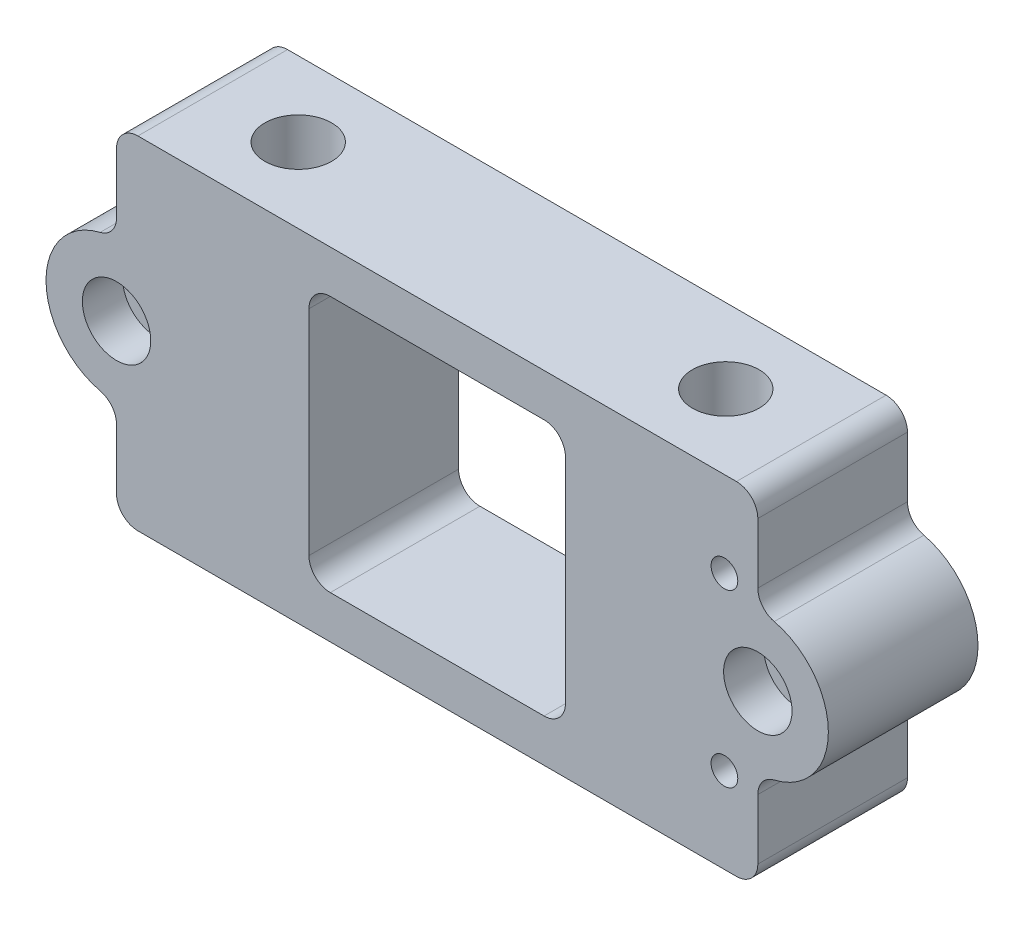
ISO-10303-21;
HEADER;
FILE_DESCRIPTION(('STEP AP214'),'2;1');
FILE_NAME('part.step','',(''),(''),'','','');
FILE_SCHEMA(('AUTOMOTIVE_DESIGN { 1 0 10303 214 1 1 1 1 }'));
ENDSEC;
DATA;
#1=APPLICATION_CONTEXT('core data for automotive mechanical design processes');
#2=APPLICATION_PROTOCOL_DEFINITION('international standard','automotive_design',2000,#1);
#3=PRODUCT_CONTEXT('',#1,'mechanical');
#4=PRODUCT('Part','Part','',(#3));
#5=PRODUCT_RELATED_PRODUCT_CATEGORY('part','',(#4));
#6=PRODUCT_DEFINITION_FORMATION('','',#4);
#7=PRODUCT_DEFINITION_CONTEXT('part definition',#1,'design');
#8=PRODUCT_DEFINITION('design','',#6,#7);
#9=PRODUCT_DEFINITION_SHAPE('','',#8);
#10=(LENGTH_UNIT() NAMED_UNIT(*) SI_UNIT(.MILLI.,.METRE.));
#11=(NAMED_UNIT(*) PLANE_ANGLE_UNIT() SI_UNIT($,.RADIAN.));
#12=(NAMED_UNIT(*) SI_UNIT($,.STERADIAN.) SOLID_ANGLE_UNIT());
#13=UNCERTAINTY_MEASURE_WITH_UNIT(LENGTH_MEASURE(1.E-05),#10,'distance_accuracy_value','');
#14=(GEOMETRIC_REPRESENTATION_CONTEXT(3) GLOBAL_UNCERTAINTY_ASSIGNED_CONTEXT((#13)) GLOBAL_UNIT_ASSIGNED_CONTEXT((#10,
#11,#12)) REPRESENTATION_CONTEXT('',''));
#15=CARTESIAN_POINT('',(0.,0.,0.));
#16=DIRECTION('',(0.,0.,1.));
#17=DIRECTION('',(1.,0.,0.));
#18=AXIS2_PLACEMENT_3D('',#15,#16,#17);
#19=CARTESIAN_POINT('',(-84.93125,0.,-17.78));
#20=DIRECTION('',(0.,0.,1.));
#21=DIRECTION('',(1.,0.,0.));
#22=AXIS2_PLACEMENT_3D('',#19,#20,#21);
#23=CYLINDRICAL_SURFACE('',#22,2.4892);
#24=CARTESIAN_POINT('',(-84.93125,0.,-17.78));
#25=DIRECTION('',(0.,0.,1.));
#26=DIRECTION('',(1.,0.,0.));
#27=AXIS2_PLACEMENT_3D('',#24,#25,#26);
#28=CIRCLE('',#27,2.4892);
#29=CARTESIAN_POINT('',(-82.44205,0.,-17.78));
#30=VERTEX_POINT('',#29);
#31=EDGE_CURVE('E446',#30,#30,#28,.T.);
#32=ORIENTED_EDGE('',*,*,#31,.F.);
#33=EDGE_LOOP('',(#32));
#34=FACE_BOUND('',#33,.T.);
#35=CARTESIAN_POINT('',(-84.93125,0.,-4.7752));
#36=DIRECTION('',(0.,0.,1.));
#37=DIRECTION('',(1.,0.,0.));
#38=AXIS2_PLACEMENT_3D('',#35,#36,#37);
#39=CIRCLE('',#38,2.4892);
#40=CARTESIAN_POINT('',(-82.44205,0.,-4.7752));
#41=VERTEX_POINT('',#40);
#42=EDGE_CURVE('E47',#41,#41,#39,.F.);
#43=ORIENTED_EDGE('',*,*,#42,.F.);
#44=EDGE_LOOP('',(#43));
#45=FACE_BOUND('',#44,.T.);
#46=ADVANCED_FACE('F43',(#34,#45),#23,.F.);
#47=CARTESIAN_POINT('',(-8.73125,0.,-17.78));
#48=DIRECTION('',(0.,0.,1.));
#49=DIRECTION('',(1.,0.,0.));
#50=AXIS2_PLACEMENT_3D('',#47,#48,#49);
#51=CYLINDRICAL_SURFACE('',#50,2.4892);
#52=CARTESIAN_POINT('',(-8.73125,0.,-17.78));
#53=DIRECTION('',(0.,0.,1.));
#54=DIRECTION('',(1.,0.,0.));
#55=AXIS2_PLACEMENT_3D('',#52,#53,#54);
#56=CIRCLE('',#55,2.4892);
#57=CARTESIAN_POINT('',(-6.24204999999999,0.,-17.78));
#58=VERTEX_POINT('',#57);
#59=EDGE_CURVE('E439',#58,#58,#56,.T.);
#60=ORIENTED_EDGE('',*,*,#59,.F.);
#61=EDGE_LOOP('',(#60));
#62=FACE_BOUND('',#61,.T.);
#63=CARTESIAN_POINT('',(-8.73125,0.,-4.7752));
#64=DIRECTION('',(0.,0.,1.));
#65=DIRECTION('',(1.,0.,0.));
#66=AXIS2_PLACEMENT_3D('',#63,#64,#65);
#67=CIRCLE('',#66,2.4892);
#68=CARTESIAN_POINT('',(-6.24204999999999,0.,-4.7752));
#69=VERTEX_POINT('',#68);
#70=EDGE_CURVE('E304',#69,#69,#67,.F.);
#71=ORIENTED_EDGE('',*,*,#70,.F.);
#72=EDGE_LOOP('',(#71));
#73=FACE_BOUND('',#72,.T.);
#74=ADVANCED_FACE('F531',(#62,#73),#51,.F.);
#75=CARTESIAN_POINT('',(-93.6625,20.32,-17.78));
#76=DIRECTION('',(0.,1.,0.));
#77=DIRECTION('',(0.,0.,1.));
#78=AXIS2_PLACEMENT_3D('',#75,#76,#77);
#79=PLANE('',#78);
#80=DIRECTION('',(-1.,0.,0.));
#81=VECTOR('',#80,1.);
#82=CARTESIAN_POINT('',(-93.6625,20.32,0.));
#83=LINE('',#82,#81);
#84=CARTESIAN_POINT('',(-11.27125,20.32,0.));
#85=VERTEX_POINT('',#84);
#86=CARTESIAN_POINT('',(-82.39125,20.32,0.));
#87=VERTEX_POINT('',#86);
#88=EDGE_CURVE('E455',#85,#87,#83,.T.);
#89=ORIENTED_EDGE('',*,*,#88,.F.);
#90=DIRECTION('',(0.,0.,1.));
#91=VECTOR('',#90,1.);
#92=CARTESIAN_POINT('',(-11.27125,20.32,-17.78));
#93=LINE('',#92,#91);
#94=CARTESIAN_POINT('',(-11.27125,20.32,-17.78));
#95=VERTEX_POINT('',#94);
#96=EDGE_CURVE('E516',#85,#95,#93,.F.);
#97=ORIENTED_EDGE('',*,*,#96,.T.);
#98=DIRECTION('',(-1.,0.,0.));
#99=VECTOR('',#98,1.);
#100=CARTESIAN_POINT('',(-93.6625,20.32,-17.78));
#101=LINE('',#100,#99);
#102=CARTESIAN_POINT('',(-82.39125,20.32,-17.78));
#103=VERTEX_POINT('',#102);
#104=EDGE_CURVE('E459',#95,#103,#101,.T.);
#105=ORIENTED_EDGE('',*,*,#104,.T.);
#106=DIRECTION('',(0.,0.,1.));
#107=VECTOR('',#106,1.);
#108=CARTESIAN_POINT('',(-82.39125,20.32,0.));
#109=LINE('',#108,#107);
#110=EDGE_CURVE('E512',#103,#87,#109,.T.);
#111=ORIENTED_EDGE('',*,*,#110,.T.);
#112=EDGE_LOOP('',(#89,#97,#105,#111));
#113=FACE_BOUND('',#112,.T.);
#114=CARTESIAN_POINT('',(-72.23125,20.32,-8.89));
#115=DIRECTION('',(0.,1.,0.));
#116=DIRECTION('',(0.,0.,1.));
#117=AXIS2_PLACEMENT_3D('',#114,#115,#116);
#118=CIRCLE('',#117,3.96874999999999);
#119=CARTESIAN_POINT('',(-72.23125,20.32,-4.92125000000001));
#120=VERTEX_POINT('',#119);
#121=EDGE_CURVE('E424',#120,#120,#118,.T.);
#122=ORIENTED_EDGE('',*,*,#121,.F.);
#123=EDGE_LOOP('',(#122));
#124=FACE_BOUND('',#123,.T.);
#125=CARTESIAN_POINT('',(-21.43125,20.32,-8.89));
#126=DIRECTION('',(0.,1.,0.));
#127=DIRECTION('',(0.,0.,1.));
#128=AXIS2_PLACEMENT_3D('',#125,#126,#127);
#129=CIRCLE('',#128,3.96875);
#130=CARTESIAN_POINT('',(-21.43125,20.32,-4.92125000000001));
#131=VERTEX_POINT('',#130);
#132=EDGE_CURVE('E343',#131,#131,#129,.T.);
#133=ORIENTED_EDGE('',*,*,#132,.F.);
#134=EDGE_LOOP('',(#133));
#135=FACE_BOUND('',#134,.T.);
#136=ADVANCED_FACE('F537',(#113,#124,#135),#79,.T.);
#137=CARTESIAN_POINT('',(-93.6625,-20.32,-17.78));
#138=DIRECTION('',(0.,-1.,0.));
#139=DIRECTION('',(0.,0.,-1.));
#140=AXIS2_PLACEMENT_3D('',#137,#138,#139);
#141=PLANE('',#140);
#142=DIRECTION('',(1.,0.,0.));
#143=VECTOR('',#142,1.);
#144=CARTESIAN_POINT('',(-93.6625,-20.32,-17.78));
#145=LINE('',#144,#143);
#146=CARTESIAN_POINT('',(-82.39125,-20.32,-17.78));
#147=VERTEX_POINT('',#146);
#148=CARTESIAN_POINT('',(-11.2712500000001,-20.32,-17.78));
#149=VERTEX_POINT('',#148);
#150=EDGE_CURVE('E463',#147,#149,#145,.T.);
#151=ORIENTED_EDGE('',*,*,#150,.T.);
#152=DIRECTION('',(0.,0.,1.));
#153=VECTOR('',#152,1.);
#154=CARTESIAN_POINT('',(-11.27125,-20.32,0.));
#155=LINE('',#154,#153);
#156=CARTESIAN_POINT('',(-11.2712500000001,-20.32,0.));
#157=VERTEX_POINT('',#156);
#158=EDGE_CURVE('E477',#149,#157,#155,.T.);
#159=ORIENTED_EDGE('',*,*,#158,.T.);
#160=DIRECTION('',(1.,0.,0.));
#161=VECTOR('',#160,1.);
#162=CARTESIAN_POINT('',(-93.6625,-20.32,0.));
#163=LINE('',#162,#161);
#164=CARTESIAN_POINT('',(-82.39125,-20.32,0.));
#165=VERTEX_POINT('',#164);
#166=EDGE_CURVE('E464',#165,#157,#163,.T.);
#167=ORIENTED_EDGE('',*,*,#166,.F.);
#168=DIRECTION('',(0.,0.,1.));
#169=VECTOR('',#168,1.);
#170=CARTESIAN_POINT('',(-82.39125,-20.32,-17.78));
#171=LINE('',#170,#169);
#172=EDGE_CURVE('E468',#165,#147,#171,.F.);
#173=ORIENTED_EDGE('',*,*,#172,.T.);
#174=EDGE_LOOP('',(#151,#159,#167,#173));
#175=FACE_BOUND('',#174,.T.);
#176=CARTESIAN_POINT('',(-72.23125,-20.32,-8.89));
#177=DIRECTION('',(0.,1.,0.));
#178=DIRECTION('',(0.,0.,1.));
#179=AXIS2_PLACEMENT_3D('',#176,#177,#178);
#180=CIRCLE('',#179,3.96874999999999);
#181=CARTESIAN_POINT('',(-72.23125,-20.32,-4.92125000000001));
#182=VERTEX_POINT('',#181);
#183=EDGE_CURVE('E419',#182,#182,#180,.T.);
#184=ORIENTED_EDGE('',*,*,#183,.T.);
#185=EDGE_LOOP('',(#184));
#186=FACE_BOUND('',#185,.T.);
#187=CARTESIAN_POINT('',(-21.43125,-20.32,-8.89));
#188=DIRECTION('',(0.,1.,0.));
#189=DIRECTION('',(0.,0.,1.));
#190=AXIS2_PLACEMENT_3D('',#187,#188,#189);
#191=CIRCLE('',#190,3.96875);
#192=CARTESIAN_POINT('',(-21.43125,-20.32,-4.92125000000001));
#193=VERTEX_POINT('',#192);
#194=EDGE_CURVE('E428',#193,#193,#191,.T.);
#195=ORIENTED_EDGE('',*,*,#194,.T.);
#196=EDGE_LOOP('',(#195));
#197=FACE_BOUND('',#196,.T.);
#198=ADVANCED_FACE('F551',(#175,#186,#197),#141,.T.);
#199=CARTESIAN_POINT('',(0.,0.,-17.78));
#200=DIRECTION('',(0.,0.,-1.));
#201=DIRECTION('',(-1.,0.,0.));
#202=AXIS2_PLACEMENT_3D('',#199,#200,#201);
#203=PLANE('',#202);
#204=CARTESIAN_POINT('',(-59.53125,-12.7,-17.78));
#205=DIRECTION('',(0.,0.,1.));
#206=DIRECTION('',(-1.,0.,0.));
#207=AXIS2_PLACEMENT_3D('',#204,#205,#206);
#208=CIRCLE('',#207,2.54);
#209=CARTESIAN_POINT('',(-62.07125,-12.7,-17.78));
#210=VERTEX_POINT('',#209);
#211=CARTESIAN_POINT('',(-59.53125,-15.24,-17.78));
#212=VERTEX_POINT('',#211);
#213=EDGE_CURVE('E209',#210,#212,#208,.T.);
#214=ORIENTED_EDGE('',*,*,#213,.T.);
#215=DIRECTION('',(1.,0.,0.));
#216=VECTOR('',#215,1.);
#217=CARTESIAN_POINT('',(-59.53125,-15.24,-17.78));
#218=LINE('',#217,#216);
#219=CARTESIAN_POINT('',(-34.13125,-15.24,-17.78));
#220=VERTEX_POINT('',#219);
#221=EDGE_CURVE('E219',#212,#220,#218,.T.);
#222=ORIENTED_EDGE('',*,*,#221,.T.);
#223=CARTESIAN_POINT('',(-34.13125,-12.7,-17.78));
#224=DIRECTION('',(0.,0.,1.));
#225=DIRECTION('',(1.,0.,0.));
#226=AXIS2_PLACEMENT_3D('',#223,#224,#225);
#227=CIRCLE('',#226,2.54);
#228=CARTESIAN_POINT('',(-31.59125,-12.7,-17.78));
#229=VERTEX_POINT('',#228);
#230=EDGE_CURVE('E61',#220,#229,#227,.T.);
#231=ORIENTED_EDGE('',*,*,#230,.T.);
#232=DIRECTION('',(0.,1.,0.));
#233=VECTOR('',#232,1.);
#234=CARTESIAN_POINT('',(-31.59125,-12.7,-17.78));
#235=LINE('',#234,#233);
#236=CARTESIAN_POINT('',(-31.59125,12.7,-17.78));
#237=VERTEX_POINT('',#236);
#238=EDGE_CURVE('E238',#229,#237,#235,.T.);
#239=ORIENTED_EDGE('',*,*,#238,.T.);
#240=CARTESIAN_POINT('',(-34.13125,12.7,-17.78));
#241=DIRECTION('',(0.,0.,1.));
#242=DIRECTION('',(-1.,0.,0.));
#243=AXIS2_PLACEMENT_3D('',#240,#241,#242);
#244=CIRCLE('',#243,2.54);
#245=CARTESIAN_POINT('',(-34.13125,15.24,-17.78));
#246=VERTEX_POINT('',#245);
#247=EDGE_CURVE('E242',#237,#246,#244,.T.);
#248=ORIENTED_EDGE('',*,*,#247,.T.);
#249=DIRECTION('',(-1.,0.,0.));
#250=VECTOR('',#249,1.);
#251=CARTESIAN_POINT('',(-59.53125,15.24,-17.78));
#252=LINE('',#251,#250);
#253=CARTESIAN_POINT('',(-59.53125,15.24,-17.78));
#254=VERTEX_POINT('',#253);
#255=EDGE_CURVE('E246',#246,#254,#252,.T.);
#256=ORIENTED_EDGE('',*,*,#255,.T.);
#257=CARTESIAN_POINT('',(-59.53125,12.7,-17.78));
#258=DIRECTION('',(0.,0.,1.));
#259=DIRECTION('',(-1.,0.,0.));
#260=AXIS2_PLACEMENT_3D('',#257,#258,#259);
#261=CIRCLE('',#260,2.54);
#262=CARTESIAN_POINT('',(-62.07125,12.7,-17.78));
#263=VERTEX_POINT('',#262);
#264=EDGE_CURVE('E250',#254,#263,#261,.T.);
#265=ORIENTED_EDGE('',*,*,#264,.T.);
#266=DIRECTION('',(0.,-1.,0.));
#267=VECTOR('',#266,1.);
#268=CARTESIAN_POINT('',(-62.07125,-12.7,-17.78));
#269=LINE('',#268,#267);
#270=EDGE_CURVE('E216',#263,#210,#269,.T.);
#271=ORIENTED_EDGE('',*,*,#270,.T.);
#272=EDGE_LOOP('',(#214,#222,#231,#239,#248,#256,#265,#271));
#273=FACE_BOUND('',#272,.T.);
#274=DIRECTION('',(0.,-1.,0.));
#275=VECTOR('',#274,1.);
#276=CARTESIAN_POINT('',(-8.73125000000001,-10.6225460224938,-17.78));
#277=LINE('',#276,#275);
#278=CARTESIAN_POINT('',(-8.73125,-10.6225460224938,-17.78));
#279=VERTEX_POINT('',#278);
#280=CARTESIAN_POINT('',(-8.73125000000004,-17.78,-17.78));
#281=VERTEX_POINT('',#280);
#282=EDGE_CURVE('E335',#279,#281,#277,.T.);
#283=ORIENTED_EDGE('',*,*,#282,.T.);
#284=CARTESIAN_POINT('',(-11.27125,-17.78,-17.78));
#285=DIRECTION('',(0.,0.,-1.));
#286=DIRECTION('',(-1.,0.,0.));
#287=AXIS2_PLACEMENT_3D('',#284,#285,#286);
#288=CIRCLE('',#287,2.54);
#289=EDGE_CURVE('E505',#281,#149,#288,.T.);
#290=ORIENTED_EDGE('',*,*,#289,.T.);
#291=ORIENTED_EDGE('',*,*,#150,.F.);
#292=CARTESIAN_POINT('',(-82.39125,-17.78,-17.78));
#293=DIRECTION('',(0.,0.,-1.));
#294=DIRECTION('',(-1.,0.,0.));
#295=AXIS2_PLACEMENT_3D('',#292,#293,#294);
#296=CIRCLE('',#295,2.54);
#297=CARTESIAN_POINT('',(-84.93125,-17.78,-17.78));
#298=VERTEX_POINT('',#297);
#299=EDGE_CURVE('E496',#147,#298,#296,.T.);
#300=ORIENTED_EDGE('',*,*,#299,.T.);
#301=DIRECTION('',(0.,1.,0.));
#302=VECTOR('',#301,1.);
#303=CARTESIAN_POINT('',(-84.93125,-10.6225460224939,-17.78));
#304=LINE('',#303,#302);
#305=CARTESIAN_POINT('',(-84.93125,-10.6225460224939,-17.78));
#306=VERTEX_POINT('',#305);
#307=EDGE_CURVE('E320',#298,#306,#304,.T.);
#308=ORIENTED_EDGE('',*,*,#307,.T.);
#309=CARTESIAN_POINT('',(-87.47125,-10.6225460224939,-17.78));
#310=DIRECTION('',(0.,0.,-1.));
#311=DIRECTION('',(-1.,0.,0.));
#312=AXIS2_PLACEMENT_3D('',#309,#310,#311);
#313=CIRCLE('',#312,2.54000000000001);
#314=CARTESIAN_POINT('',(-86.8805523255814,-8.152186482379,-17.78));
#315=VERTEX_POINT('',#314);
#316=EDGE_CURVE('E355',#306,#315,#313,.F.);
#317=ORIENTED_EDGE('',*,*,#316,.T.);
#318=CARTESIAN_POINT('',(-84.93125,0.,-17.78));
#319=DIRECTION('',(0.,0.,-1.));
#320=DIRECTION('',(-1.,0.,0.));
#321=AXIS2_PLACEMENT_3D('',#318,#319,#320);
#322=CIRCLE('',#321,8.382);
#323=CARTESIAN_POINT('',(-86.8805523255814,8.152186482379,-17.78));
#324=VERTEX_POINT('',#323);
#325=EDGE_CURVE('E350',#315,#324,#322,.T.);
#326=ORIENTED_EDGE('',*,*,#325,.T.);
#327=CARTESIAN_POINT('',(-87.47125,10.6225460224939,-17.78));
#328=DIRECTION('',(0.,0.,-1.));
#329=DIRECTION('',(-1.,0.,0.));
#330=AXIS2_PLACEMENT_3D('',#327,#328,#329);
#331=CIRCLE('',#330,2.54000000000001);
#332=CARTESIAN_POINT('',(-84.93125,10.6225460224939,-17.78));
#333=VERTEX_POINT('',#332);
#334=EDGE_CURVE('E345',#324,#333,#331,.F.);
#335=ORIENTED_EDGE('',*,*,#334,.T.);
#336=DIRECTION('',(0.,1.,0.));
#337=VECTOR('',#336,1.);
#338=CARTESIAN_POINT('',(-84.93125,10.6225460224939,-17.78));
#339=LINE('',#338,#337);
#340=CARTESIAN_POINT('',(-84.93125,17.78,-17.78));
#341=VERTEX_POINT('',#340);
#342=EDGE_CURVE('E339',#333,#341,#339,.T.);
#343=ORIENTED_EDGE('',*,*,#342,.T.);
#344=CARTESIAN_POINT('',(-82.39125,17.78,-17.78));
#345=DIRECTION('',(0.,0.,-1.));
#346=DIRECTION('',(-1.,0.,0.));
#347=AXIS2_PLACEMENT_3D('',#344,#345,#346);
#348=CIRCLE('',#347,2.54);
#349=EDGE_CURVE('E499',#341,#103,#348,.T.);
#350=ORIENTED_EDGE('',*,*,#349,.T.);
#351=ORIENTED_EDGE('',*,*,#104,.F.);
#352=CARTESIAN_POINT('',(-11.27125,17.78,-17.78));
#353=DIRECTION('',(0.,0.,-1.));
#354=DIRECTION('',(-1.,0.,0.));
#355=AXIS2_PLACEMENT_3D('',#352,#353,#354);
#356=CIRCLE('',#355,2.54);
#357=CARTESIAN_POINT('',(-8.73124999999999,17.78,-17.78));
#358=VERTEX_POINT('',#357);
#359=EDGE_CURVE('E502',#95,#358,#356,.T.);
#360=ORIENTED_EDGE('',*,*,#359,.T.);
#361=DIRECTION('',(0.,-1.,0.));
#362=VECTOR('',#361,1.);
#363=CARTESIAN_POINT('',(-8.73124999999998,10.6225460224939,-17.78));
#364=LINE('',#363,#362);
#365=CARTESIAN_POINT('',(-8.73124999999998,10.6225460224939,-17.78));
#366=VERTEX_POINT('',#365);
#367=EDGE_CURVE('E373',#358,#366,#364,.T.);
#368=ORIENTED_EDGE('',*,*,#367,.T.);
#369=CARTESIAN_POINT('',(-6.19124999999997,10.6225460224939,-17.78));
#370=DIRECTION('',(0.,0.,-1.));
#371=DIRECTION('',(-1.,0.,0.));
#372=AXIS2_PLACEMENT_3D('',#369,#370,#371);
#373=CIRCLE('',#372,2.54000000000001);
#374=CARTESIAN_POINT('',(-6.78194767441858,8.15218648237901,-17.78));
#375=VERTEX_POINT('',#374);
#376=EDGE_CURVE('E402',#366,#375,#373,.F.);
#377=ORIENTED_EDGE('',*,*,#376,.T.);
#378=CARTESIAN_POINT('',(-8.73125,0.,-17.78));
#379=DIRECTION('',(0.,0.,-1.));
#380=DIRECTION('',(-1.,0.,0.));
#381=AXIS2_PLACEMENT_3D('',#378,#379,#380);
#382=CIRCLE('',#381,8.382);
#383=CARTESIAN_POINT('',(-6.7819476744186,-8.152186482379,-17.78));
#384=VERTEX_POINT('',#383);
#385=EDGE_CURVE('E397',#375,#384,#382,.T.);
#386=ORIENTED_EDGE('',*,*,#385,.T.);
#387=CARTESIAN_POINT('',(-6.19125,-10.6225460224938,-17.78));
#388=DIRECTION('',(0.,0.,-1.));
#389=DIRECTION('',(-1.,0.,0.));
#390=AXIS2_PLACEMENT_3D('',#387,#388,#389);
#391=CIRCLE('',#390,2.54000000000001);
#392=EDGE_CURVE('E392',#384,#279,#391,.F.);
#393=ORIENTED_EDGE('',*,*,#392,.T.);
#394=EDGE_LOOP('',(#283,#290,#291,#300,#308,#317,#326,#335,#343,#350,#351,#360,#368,#377,#386,#393));
#395=FACE_BOUND('',#394,.T.);
#396=CARTESIAN_POINT('',(-12.7,-10.16,-17.78));
#397=DIRECTION('',(0.,0.,1.));
#398=DIRECTION('',(1.,0.,0.));
#399=AXIS2_PLACEMENT_3D('',#396,#397,#398);
#400=CIRCLE('',#399,1.5875);
#401=CARTESIAN_POINT('',(-11.1125,-10.16,-17.78));
#402=VERTEX_POINT('',#401);
#403=EDGE_CURVE('E435',#402,#402,#400,.T.);
#404=ORIENTED_EDGE('',*,*,#403,.T.);
#405=EDGE_LOOP('',(#404));
#406=FACE_BOUND('',#405,.T.);
#407=ORIENTED_EDGE('',*,*,#59,.T.);
#408=EDGE_LOOP('',(#407));
#409=FACE_BOUND('',#408,.T.);
#410=ORIENTED_EDGE('',*,*,#31,.T.);
#411=EDGE_LOOP('',(#410));
#412=FACE_BOUND('',#411,.T.);
#413=CARTESIAN_POINT('',(-12.7,10.16,-17.78));
#414=DIRECTION('',(0.,0.,1.));
#415=DIRECTION('',(1.,0.,0.));
#416=AXIS2_PLACEMENT_3D('',#413,#414,#415);
#417=CIRCLE('',#416,1.5875);
#418=CARTESIAN_POINT('',(-11.1125,10.16,-17.78));
#419=VERTEX_POINT('',#418);
#420=EDGE_CURVE('E451',#419,#419,#417,.T.);
#421=ORIENTED_EDGE('',*,*,#420,.T.);
#422=EDGE_LOOP('',(#421));
#423=FACE_BOUND('',#422,.T.);
#424=ADVANCED_FACE('F224',(#273,#395,#406,#409,#412,#423),#203,.T.);
#425=CARTESIAN_POINT('',(0.,0.,0.));
#426=DIRECTION('',(0.,0.,-1.));
#427=DIRECTION('',(-1.,0.,0.));
#428=AXIS2_PLACEMENT_3D('',#425,#426,#427);
#429=PLANE('',#428);
#430=DIRECTION('',(1.,0.,0.));
#431=VECTOR('',#430,1.);
#432=CARTESIAN_POINT('',(-59.53125,-15.24,0.));
#433=LINE('',#432,#431);
#434=CARTESIAN_POINT('',(-59.53125,-15.24,0.));
#435=VERTEX_POINT('',#434);
#436=CARTESIAN_POINT('',(-34.13125,-15.24,0.));
#437=VERTEX_POINT('',#436);
#438=EDGE_CURVE('E257',#435,#437,#433,.T.);
#439=ORIENTED_EDGE('',*,*,#438,.F.);
#440=CARTESIAN_POINT('',(-59.53125,-12.7,0.));
#441=DIRECTION('',(0.,0.,1.));
#442=DIRECTION('',(-1.,0.,0.));
#443=AXIS2_PLACEMENT_3D('',#440,#441,#442);
#444=CIRCLE('',#443,2.54);
#445=CARTESIAN_POINT('',(-62.07125,-12.7,0.));
#446=VERTEX_POINT('',#445);
#447=EDGE_CURVE('E69',#446,#435,#444,.T.);
#448=ORIENTED_EDGE('',*,*,#447,.F.);
#449=DIRECTION('',(0.,-1.,0.));
#450=VECTOR('',#449,1.);
#451=CARTESIAN_POINT('',(-62.07125,-12.7,0.));
#452=LINE('',#451,#450);
#453=CARTESIAN_POINT('',(-62.07125,12.7,0.));
#454=VERTEX_POINT('',#453);
#455=EDGE_CURVE('E229',#454,#446,#452,.T.);
#456=ORIENTED_EDGE('',*,*,#455,.F.);
#457=CARTESIAN_POINT('',(-59.53125,12.7,0.));
#458=DIRECTION('',(0.,0.,1.));
#459=DIRECTION('',(-1.,0.,0.));
#460=AXIS2_PLACEMENT_3D('',#457,#458,#459);
#461=CIRCLE('',#460,2.54);
#462=CARTESIAN_POINT('',(-59.53125,15.24,0.));
#463=VERTEX_POINT('',#462);
#464=EDGE_CURVE('E233',#463,#454,#461,.T.);
#465=ORIENTED_EDGE('',*,*,#464,.F.);
#466=DIRECTION('',(-1.,0.,0.));
#467=VECTOR('',#466,1.);
#468=CARTESIAN_POINT('',(-59.53125,15.24,0.));
#469=LINE('',#468,#467);
#470=CARTESIAN_POINT('',(-34.13125,15.24,0.));
#471=VERTEX_POINT('',#470);
#472=EDGE_CURVE('E272',#471,#463,#469,.T.);
#473=ORIENTED_EDGE('',*,*,#472,.F.);
#474=CARTESIAN_POINT('',(-34.13125,12.7,0.));
#475=DIRECTION('',(0.,0.,1.));
#476=DIRECTION('',(-1.,0.,0.));
#477=AXIS2_PLACEMENT_3D('',#474,#475,#476);
#478=CIRCLE('',#477,2.54);
#479=CARTESIAN_POINT('',(-31.59125,12.7,0.));
#480=VERTEX_POINT('',#479);
#481=EDGE_CURVE('E268',#480,#471,#478,.T.);
#482=ORIENTED_EDGE('',*,*,#481,.F.);
#483=DIRECTION('',(0.,1.,0.));
#484=VECTOR('',#483,1.);
#485=CARTESIAN_POINT('',(-31.59125,-12.7,0.));
#486=LINE('',#485,#484);
#487=CARTESIAN_POINT('',(-31.59125,-12.7,0.));
#488=VERTEX_POINT('',#487);
#489=EDGE_CURVE('E264',#488,#480,#486,.T.);
#490=ORIENTED_EDGE('',*,*,#489,.F.);
#491=CARTESIAN_POINT('',(-34.13125,-12.7,0.));
#492=DIRECTION('',(0.,0.,1.));
#493=DIRECTION('',(1.,0.,0.));
#494=AXIS2_PLACEMENT_3D('',#491,#492,#493);
#495=CIRCLE('',#494,2.54);
#496=EDGE_CURVE('E260',#437,#488,#495,.T.);
#497=ORIENTED_EDGE('',*,*,#496,.F.);
#498=EDGE_LOOP('',(#439,#448,#456,#465,#473,#482,#490,#497));
#499=FACE_BOUND('',#498,.T.);
#500=CARTESIAN_POINT('',(-8.73125,0.,0.));
#501=DIRECTION('',(0.,0.,1.));
#502=DIRECTION('',(1.,0.,0.));
#503=AXIS2_PLACEMENT_3D('',#500,#501,#502);
#504=CIRCLE('',#503,4.06400000000002);
#505=CARTESIAN_POINT('',(-4.66724999999998,0.,0.));
#506=VERTEX_POINT('',#505);
#507=EDGE_CURVE('E305',#506,#506,#504,.T.);
#508=ORIENTED_EDGE('',*,*,#507,.F.);
#509=EDGE_LOOP('',(#508));
#510=FACE_BOUND('',#509,.T.);
#511=CARTESIAN_POINT('',(-84.93125,0.,0.));
#512=DIRECTION('',(0.,0.,1.));
#513=DIRECTION('',(1.,0.,0.));
#514=AXIS2_PLACEMENT_3D('',#511,#512,#513);
#515=CIRCLE('',#514,4.06400000000002);
#516=CARTESIAN_POINT('',(-80.86725,0.,0.));
#517=VERTEX_POINT('',#516);
#518=EDGE_CURVE('E282',#517,#517,#515,.T.);
#519=ORIENTED_EDGE('',*,*,#518,.F.);
#520=EDGE_LOOP('',(#519));
#521=FACE_BOUND('',#520,.T.);
#522=CARTESIAN_POINT('',(-12.7,-10.16,0.));
#523=DIRECTION('',(0.,0.,1.));
#524=DIRECTION('',(1.,0.,0.));
#525=AXIS2_PLACEMENT_3D('',#522,#523,#524);
#526=CIRCLE('',#525,1.5875);
#527=CARTESIAN_POINT('',(-11.1125,-10.16,0.));
#528=VERTEX_POINT('',#527);
#529=EDGE_CURVE('E423',#528,#528,#526,.T.);
#530=ORIENTED_EDGE('',*,*,#529,.F.);
#531=EDGE_LOOP('',(#530));
#532=FACE_BOUND('',#531,.T.);
#533=CARTESIAN_POINT('',(-12.7,10.16,0.));
#534=DIRECTION('',(0.,0.,1.));
#535=DIRECTION('',(1.,0.,0.));
#536=AXIS2_PLACEMENT_3D('',#533,#534,#535);
#537=CIRCLE('',#536,1.5875);
#538=CARTESIAN_POINT('',(-11.1125,10.16,0.));
#539=VERTEX_POINT('',#538);
#540=EDGE_CURVE('E450',#539,#539,#537,.T.);
#541=ORIENTED_EDGE('',*,*,#540,.F.);
#542=EDGE_LOOP('',(#541));
#543=FACE_BOUND('',#542,.T.);
#544=ORIENTED_EDGE('',*,*,#166,.T.);
#545=CARTESIAN_POINT('',(-11.27125,-17.78,0.));
#546=DIRECTION('',(0.,0.,-1.));
#547=DIRECTION('',(-1.,0.,0.));
#548=AXIS2_PLACEMENT_3D('',#545,#546,#547);
#549=CIRCLE('',#548,2.54);
#550=CARTESIAN_POINT('',(-8.73125000000004,-17.78,0.));
#551=VERTEX_POINT('',#550);
#552=EDGE_CURVE('E490',#157,#551,#549,.F.);
#553=ORIENTED_EDGE('',*,*,#552,.T.);
#554=DIRECTION('',(0.,-1.,0.));
#555=VECTOR('',#554,1.);
#556=CARTESIAN_POINT('',(-8.73125000000001,-10.6225460224938,0.));
#557=LINE('',#556,#555);
#558=CARTESIAN_POINT('',(-8.73125000000001,-10.6225460224938,0.));
#559=VERTEX_POINT('',#558);
#560=EDGE_CURVE('E369',#559,#551,#557,.T.);
#561=ORIENTED_EDGE('',*,*,#560,.F.);
#562=CARTESIAN_POINT('',(-6.19125,-10.6225460224938,0.));
#563=DIRECTION('',(0.,0.,1.));
#564=DIRECTION('',(-1.,0.,0.));
#565=AXIS2_PLACEMENT_3D('',#562,#563,#564);
#566=CIRCLE('',#565,2.54000000000001);
#567=CARTESIAN_POINT('',(-6.7819476744186,-8.152186482379,0.));
#568=VERTEX_POINT('',#567);
#569=EDGE_CURVE('E374',#568,#559,#566,.T.);
#570=ORIENTED_EDGE('',*,*,#569,.F.);
#571=CARTESIAN_POINT('',(-8.73125,0.,0.));
#572=DIRECTION('',(0.,0.,-1.));
#573=DIRECTION('',(-1.,0.,0.));
#574=AXIS2_PLACEMENT_3D('',#571,#572,#573);
#575=CIRCLE('',#574,8.382);
#576=CARTESIAN_POINT('',(-6.78194767441858,8.15218648237901,0.));
#577=VERTEX_POINT('',#576);
#578=EDGE_CURVE('E377',#577,#568,#575,.T.);
#579=ORIENTED_EDGE('',*,*,#578,.F.);
#580=CARTESIAN_POINT('',(-6.19124999999997,10.6225460224939,0.));
#581=DIRECTION('',(0.,0.,1.));
#582=DIRECTION('',(1.,0.,0.));
#583=AXIS2_PLACEMENT_3D('',#580,#581,#582);
#584=CIRCLE('',#583,2.54000000000001);
#585=CARTESIAN_POINT('',(-8.73124999999998,10.6225460224939,0.));
#586=VERTEX_POINT('',#585);
#587=EDGE_CURVE('E381',#586,#577,#584,.T.);
#588=ORIENTED_EDGE('',*,*,#587,.F.);
#589=DIRECTION('',(0.,-1.,0.));
#590=VECTOR('',#589,1.);
#591=CARTESIAN_POINT('',(-8.73124999999998,10.6225460224939,0.));
#592=LINE('',#591,#590);
#593=CARTESIAN_POINT('',(-8.73124999999999,17.78,0.));
#594=VERTEX_POINT('',#593);
#595=EDGE_CURVE('E385',#594,#586,#592,.T.);
#596=ORIENTED_EDGE('',*,*,#595,.F.);
#597=CARTESIAN_POINT('',(-11.27125,17.78,0.));
#598=DIRECTION('',(0.,0.,-1.));
#599=DIRECTION('',(-1.,0.,0.));
#600=AXIS2_PLACEMENT_3D('',#597,#598,#599);
#601=CIRCLE('',#600,2.54);
#602=EDGE_CURVE('E487',#594,#85,#601,.F.);
#603=ORIENTED_EDGE('',*,*,#602,.T.);
#604=ORIENTED_EDGE('',*,*,#88,.T.);
#605=CARTESIAN_POINT('',(-82.39125,17.78,0.));
#606=DIRECTION('',(0.,0.,-1.));
#607=DIRECTION('',(-1.,0.,0.));
#608=AXIS2_PLACEMENT_3D('',#605,#606,#607);
#609=CIRCLE('',#608,2.54);
#610=CARTESIAN_POINT('',(-84.93125,17.78,0.));
#611=VERTEX_POINT('',#610);
#612=EDGE_CURVE('E484',#87,#611,#609,.F.);
#613=ORIENTED_EDGE('',*,*,#612,.T.);
#614=DIRECTION('',(0.,1.,0.));
#615=VECTOR('',#614,1.);
#616=CARTESIAN_POINT('',(-84.93125,10.6225460224939,0.));
#617=LINE('',#616,#615);
#618=CARTESIAN_POINT('',(-84.93125,10.6225460224939,0.));
#619=VERTEX_POINT('',#618);
#620=EDGE_CURVE('E316',#619,#611,#617,.T.);
#621=ORIENTED_EDGE('',*,*,#620,.F.);
#622=CARTESIAN_POINT('',(-87.47125,10.6225460224939,0.));
#623=DIRECTION('',(0.,0.,1.));
#624=DIRECTION('',(-1.,0.,0.));
#625=AXIS2_PLACEMENT_3D('',#622,#623,#624);
#626=CIRCLE('',#625,2.54000000000001);
#627=CARTESIAN_POINT('',(-86.8805523255814,8.152186482379,0.));
#628=VERTEX_POINT('',#627);
#629=EDGE_CURVE('E321',#628,#619,#626,.T.);
#630=ORIENTED_EDGE('',*,*,#629,.F.);
#631=CARTESIAN_POINT('',(-84.93125,0.,0.));
#632=DIRECTION('',(0.,0.,-1.));
#633=DIRECTION('',(1.,0.,0.));
#634=AXIS2_PLACEMENT_3D('',#631,#632,#633);
#635=CIRCLE('',#634,8.382);
#636=CARTESIAN_POINT('',(-86.8805523255814,-8.152186482379,0.));
#637=VERTEX_POINT('',#636);
#638=EDGE_CURVE('E324',#637,#628,#635,.T.);
#639=ORIENTED_EDGE('',*,*,#638,.F.);
#640=CARTESIAN_POINT('',(-87.47125,-10.6225460224939,0.));
#641=DIRECTION('',(0.,0.,1.));
#642=DIRECTION('',(1.,0.,0.));
#643=AXIS2_PLACEMENT_3D('',#640,#641,#642);
#644=CIRCLE('',#643,2.54000000000001);
#645=CARTESIAN_POINT('',(-84.93125,-10.6225460224939,0.));
#646=VERTEX_POINT('',#645);
#647=EDGE_CURVE('E328',#646,#637,#644,.T.);
#648=ORIENTED_EDGE('',*,*,#647,.F.);
#649=DIRECTION('',(0.,1.,0.));
#650=VECTOR('',#649,1.);
#651=CARTESIAN_POINT('',(-84.93125,-10.6225460224939,0.));
#652=LINE('',#651,#650);
#653=CARTESIAN_POINT('',(-84.93125,-17.78,0.));
#654=VERTEX_POINT('',#653);
#655=EDGE_CURVE('E332',#654,#646,#652,.T.);
#656=ORIENTED_EDGE('',*,*,#655,.F.);
#657=CARTESIAN_POINT('',(-82.39125,-17.78,0.));
#658=DIRECTION('',(0.,0.,-1.));
#659=DIRECTION('',(-1.,0.,0.));
#660=AXIS2_PLACEMENT_3D('',#657,#658,#659);
#661=CIRCLE('',#660,2.54);
#662=EDGE_CURVE('E481',#654,#165,#661,.F.);
#663=ORIENTED_EDGE('',*,*,#662,.T.);
#664=EDGE_LOOP('',(#544,#553,#561,#570,#579,#588,#596,#603,#604,#613,#621,#630,#639,#648,#656,#663));
#665=FACE_BOUND('',#664,.T.);
#666=ADVANCED_FACE('F547',(#499,#510,#521,#532,#543,#665),#429,.F.);
#667=CARTESIAN_POINT('',(-12.7,10.16,-17.78));
#668=DIRECTION('',(0.,0.,1.));
#669=DIRECTION('',(1.,0.,0.));
#670=AXIS2_PLACEMENT_3D('',#667,#668,#669);
#671=CYLINDRICAL_SURFACE('',#670,1.5875);
#672=ORIENTED_EDGE('',*,*,#420,.F.);
#673=EDGE_LOOP('',(#672));
#674=FACE_BOUND('',#673,.T.);
#675=ORIENTED_EDGE('',*,*,#540,.T.);
#676=EDGE_LOOP('',(#675));
#677=FACE_BOUND('',#676,.T.);
#678=ADVANCED_FACE('F543',(#674,#677),#671,.F.);
#679=CARTESIAN_POINT('',(-12.7,-10.16,-17.78));
#680=DIRECTION('',(0.,0.,1.));
#681=DIRECTION('',(1.,0.,0.));
#682=AXIS2_PLACEMENT_3D('',#679,#680,#681);
#683=CYLINDRICAL_SURFACE('',#682,1.5875);
#684=ORIENTED_EDGE('',*,*,#403,.F.);
#685=EDGE_LOOP('',(#684));
#686=FACE_BOUND('',#685,.T.);
#687=ORIENTED_EDGE('',*,*,#529,.T.);
#688=EDGE_LOOP('',(#687));
#689=FACE_BOUND('',#688,.T.);
#690=ADVANCED_FACE('F546',(#686,#689),#683,.F.);
#691=CARTESIAN_POINT('',(-21.43125,-20.32,-8.89));
#692=DIRECTION('',(0.,1.,0.));
#693=DIRECTION('',(0.,0.,1.));
#694=AXIS2_PLACEMENT_3D('',#691,#692,#693);
#695=CYLINDRICAL_SURFACE('',#694,3.96875);
#696=ORIENTED_EDGE('',*,*,#194,.F.);
#697=EDGE_LOOP('',(#696));
#698=FACE_BOUND('',#697,.T.);
#699=ORIENTED_EDGE('',*,*,#132,.T.);
#700=EDGE_LOOP('',(#699));
#701=FACE_BOUND('',#700,.T.);
#702=ADVANCED_FACE('F667',(#698,#701),#695,.F.);
#703=CARTESIAN_POINT('',(-72.23125,-20.32,-8.89));
#704=DIRECTION('',(0.,1.,0.));
#705=DIRECTION('',(0.,0.,1.));
#706=AXIS2_PLACEMENT_3D('',#703,#704,#705);
#707=CYLINDRICAL_SURFACE('',#706,3.96874999999999);
#708=ORIENTED_EDGE('',*,*,#183,.F.);
#709=EDGE_LOOP('',(#708));
#710=FACE_BOUND('',#709,.T.);
#711=ORIENTED_EDGE('',*,*,#121,.T.);
#712=EDGE_LOOP('',(#711));
#713=FACE_BOUND('',#712,.T.);
#714=ADVANCED_FACE('F664',(#710,#713),#707,.F.);
#715=CARTESIAN_POINT('',(-8.73124999999998,10.6225460224939,-59.3473468790409));
#716=DIRECTION('',(-1.,0.,0.));
#717=DIRECTION('',(0.,-1.,0.));
#718=AXIS2_PLACEMENT_3D('',#715,#716,#717);
#719=PLANE('',#718);
#720=ORIENTED_EDGE('',*,*,#367,.F.);
#721=DIRECTION('',(0.,0.,1.));
#722=VECTOR('',#721,1.);
#723=CARTESIAN_POINT('',(-8.73124999999999,17.78,0.));
#724=LINE('',#723,#722);
#725=EDGE_CURVE('E508',#358,#594,#724,.T.);
#726=ORIENTED_EDGE('',*,*,#725,.T.);
#727=ORIENTED_EDGE('',*,*,#595,.T.);
#728=DIRECTION('',(0.,0.,1.));
#729=VECTOR('',#728,1.);
#730=CARTESIAN_POINT('',(-8.73124999999998,10.6225460224939,-59.3473468790409));
#731=LINE('',#730,#729);
#732=EDGE_CURVE('E406',#366,#586,#731,.T.);
#733=ORIENTED_EDGE('',*,*,#732,.F.);
#734=EDGE_LOOP('',(#720,#726,#727,#733));
#735=FACE_BOUND('',#734,.T.);
#736=ADVANCED_FACE('F591',(#735),#719,.F.);
#737=CARTESIAN_POINT('',(-6.19124999999997,10.6225460224939,-59.3473468790409));
#738=DIRECTION('',(0.,0.,1.));
#739=DIRECTION('',(1.,0.,0.));
#740=AXIS2_PLACEMENT_3D('',#737,#738,#739);
#741=CYLINDRICAL_SURFACE('',#740,2.54000000000001);
#742=ORIENTED_EDGE('',*,*,#732,.T.);
#743=ORIENTED_EDGE('',*,*,#587,.T.);
#744=DIRECTION('',(0.,0.,1.));
#745=VECTOR('',#744,1.);
#746=CARTESIAN_POINT('',(-6.78194767441858,8.15218648237901,-59.3473468790409));
#747=LINE('',#746,#745);
#748=EDGE_CURVE('E401',#375,#577,#747,.T.);
#749=ORIENTED_EDGE('',*,*,#748,.F.);
#750=ORIENTED_EDGE('',*,*,#376,.F.);
#751=EDGE_LOOP('',(#742,#743,#749,#750));
#752=FACE_BOUND('',#751,.T.);
#753=ADVANCED_FACE('F595',(#752),#741,.F.);
#754=CARTESIAN_POINT('',(-8.73125,0.,-59.3473468790409));
#755=DIRECTION('',(0.,0.,1.));
#756=DIRECTION('',(1.,0.,0.));
#757=AXIS2_PLACEMENT_3D('',#754,#755,#756);
#758=CYLINDRICAL_SURFACE('',#757,8.382);
#759=ORIENTED_EDGE('',*,*,#748,.T.);
#760=ORIENTED_EDGE('',*,*,#578,.T.);
#761=DIRECTION('',(0.,0.,1.));
#762=VECTOR('',#761,1.);
#763=CARTESIAN_POINT('',(-6.7819476744186,-8.152186482379,-59.3473468790409));
#764=LINE('',#763,#762);
#765=EDGE_CURVE('E396',#384,#568,#764,.T.);
#766=ORIENTED_EDGE('',*,*,#765,.F.);
#767=ORIENTED_EDGE('',*,*,#385,.F.);
#768=EDGE_LOOP('',(#759,#760,#766,#767));
#769=FACE_BOUND('',#768,.T.);
#770=ADVANCED_FACE('F603',(#769),#758,.T.);
#771=CARTESIAN_POINT('',(-6.19125,-10.6225460224938,-59.3473468790409));
#772=DIRECTION('',(0.,0.,1.));
#773=DIRECTION('',(1.,0.,0.));
#774=AXIS2_PLACEMENT_3D('',#771,#772,#773);
#775=CYLINDRICAL_SURFACE('',#774,2.54000000000001);
#776=ORIENTED_EDGE('',*,*,#765,.T.);
#777=ORIENTED_EDGE('',*,*,#569,.T.);
#778=DIRECTION('',(0.,0.,1.));
#779=VECTOR('',#778,1.);
#780=CARTESIAN_POINT('',(-8.73125,-10.6225460224938,-59.3473468790409));
#781=LINE('',#780,#779);
#782=EDGE_CURVE('E391',#279,#559,#781,.T.);
#783=ORIENTED_EDGE('',*,*,#782,.F.);
#784=ORIENTED_EDGE('',*,*,#392,.F.);
#785=EDGE_LOOP('',(#776,#777,#783,#784));
#786=FACE_BOUND('',#785,.T.);
#787=ADVANCED_FACE('F607',(#786),#775,.F.);
#788=CARTESIAN_POINT('',(-8.73125000000001,-10.6225460224938,-59.3473468790409));
#789=DIRECTION('',(-1.,0.,0.));
#790=DIRECTION('',(0.,-1.,0.));
#791=AXIS2_PLACEMENT_3D('',#788,#789,#790);
#792=PLANE('',#791);
#793=ORIENTED_EDGE('',*,*,#560,.T.);
#794=DIRECTION('',(0.,0.,1.));
#795=VECTOR('',#794,1.);
#796=CARTESIAN_POINT('',(-8.73125000000004,-17.78,-17.78));
#797=LINE('',#796,#795);
#798=EDGE_CURVE('E493',#551,#281,#797,.F.);
#799=ORIENTED_EDGE('',*,*,#798,.T.);
#800=ORIENTED_EDGE('',*,*,#282,.F.);
#801=ORIENTED_EDGE('',*,*,#782,.T.);
#802=EDGE_LOOP('',(#793,#799,#800,#801));
#803=FACE_BOUND('',#802,.T.);
#804=ADVANCED_FACE('F609',(#803),#792,.F.);
#805=CARTESIAN_POINT('',(-84.93125,-10.6225460224939,-59.3473468790409));
#806=DIRECTION('',(1.,0.,0.));
#807=DIRECTION('',(0.,1.,0.));
#808=AXIS2_PLACEMENT_3D('',#805,#806,#807);
#809=PLANE('',#808);
#810=ORIENTED_EDGE('',*,*,#307,.F.);
#811=DIRECTION('',(0.,0.,1.));
#812=VECTOR('',#811,1.);
#813=CARTESIAN_POINT('',(-84.93125,-17.78,0.));
#814=LINE('',#813,#812);
#815=EDGE_CURVE('E11',#298,#654,#814,.T.);
#816=ORIENTED_EDGE('',*,*,#815,.T.);
#817=ORIENTED_EDGE('',*,*,#655,.T.);
#818=DIRECTION('',(0.,0.,1.));
#819=VECTOR('',#818,1.);
#820=CARTESIAN_POINT('',(-84.93125,-10.6225460224939,-59.3473468790409));
#821=LINE('',#820,#819);
#822=EDGE_CURVE('E338',#306,#646,#821,.T.);
#823=ORIENTED_EDGE('',*,*,#822,.F.);
#824=EDGE_LOOP('',(#810,#816,#817,#823));
#825=FACE_BOUND('',#824,.T.);
#826=ADVANCED_FACE('F621',(#825),#809,.F.);
#827=CARTESIAN_POINT('',(-87.47125,-10.6225460224939,-59.3473468790409));
#828=DIRECTION('',(0.,0.,1.));
#829=DIRECTION('',(1.,0.,0.));
#830=AXIS2_PLACEMENT_3D('',#827,#828,#829);
#831=CYLINDRICAL_SURFACE('',#830,2.54000000000001);
#832=ORIENTED_EDGE('',*,*,#822,.T.);
#833=ORIENTED_EDGE('',*,*,#647,.T.);
#834=DIRECTION('',(0.,0.,1.));
#835=VECTOR('',#834,1.);
#836=CARTESIAN_POINT('',(-86.8805523255814,-8.152186482379,-59.3473468790409));
#837=LINE('',#836,#835);
#838=EDGE_CURVE('E354',#315,#637,#837,.T.);
#839=ORIENTED_EDGE('',*,*,#838,.F.);
#840=ORIENTED_EDGE('',*,*,#316,.F.);
#841=EDGE_LOOP('',(#832,#833,#839,#840));
#842=FACE_BOUND('',#841,.T.);
#843=ADVANCED_FACE('F628',(#842),#831,.F.);
#844=CARTESIAN_POINT('',(-84.93125,0.,-59.3473468790409));
#845=DIRECTION('',(0.,0.,1.));
#846=DIRECTION('',(1.,0.,0.));
#847=AXIS2_PLACEMENT_3D('',#844,#845,#846);
#848=CYLINDRICAL_SURFACE('',#847,8.382);
#849=ORIENTED_EDGE('',*,*,#838,.T.);
#850=ORIENTED_EDGE('',*,*,#638,.T.);
#851=DIRECTION('',(0.,0.,1.));
#852=VECTOR('',#851,1.);
#853=CARTESIAN_POINT('',(-86.8805523255814,8.152186482379,-59.3473468790409));
#854=LINE('',#853,#852);
#855=EDGE_CURVE('E349',#324,#628,#854,.T.);
#856=ORIENTED_EDGE('',*,*,#855,.F.);
#857=ORIENTED_EDGE('',*,*,#325,.F.);
#858=EDGE_LOOP('',(#849,#850,#856,#857));
#859=FACE_BOUND('',#858,.T.);
#860=ADVANCED_FACE('F632',(#859),#848,.T.);
#861=CARTESIAN_POINT('',(-87.47125,10.6225460224939,-59.3473468790409));
#862=DIRECTION('',(0.,0.,1.));
#863=DIRECTION('',(1.,0.,0.));
#864=AXIS2_PLACEMENT_3D('',#861,#862,#863);
#865=CYLINDRICAL_SURFACE('',#864,2.54000000000001);
#866=ORIENTED_EDGE('',*,*,#855,.T.);
#867=ORIENTED_EDGE('',*,*,#629,.T.);
#868=DIRECTION('',(0.,0.,1.));
#869=VECTOR('',#868,1.);
#870=CARTESIAN_POINT('',(-84.93125,10.6225460224939,-59.3473468790409));
#871=LINE('',#870,#869);
#872=EDGE_CURVE('E344',#333,#619,#871,.T.);
#873=ORIENTED_EDGE('',*,*,#872,.F.);
#874=ORIENTED_EDGE('',*,*,#334,.F.);
#875=EDGE_LOOP('',(#866,#867,#873,#874));
#876=FACE_BOUND('',#875,.T.);
#877=ADVANCED_FACE('F634',(#876),#865,.F.);
#878=CARTESIAN_POINT('',(-84.93125,10.6225460224939,-59.3473468790409));
#879=DIRECTION('',(1.,0.,0.));
#880=DIRECTION('',(0.,1.,0.));
#881=AXIS2_PLACEMENT_3D('',#878,#879,#880);
#882=PLANE('',#881);
#883=ORIENTED_EDGE('',*,*,#620,.T.);
#884=DIRECTION('',(0.,0.,1.));
#885=VECTOR('',#884,1.);
#886=CARTESIAN_POINT('',(-84.93125,17.78,-17.78));
#887=LINE('',#886,#885);
#888=EDGE_CURVE('E53',#611,#341,#887,.F.);
#889=ORIENTED_EDGE('',*,*,#888,.T.);
#890=ORIENTED_EDGE('',*,*,#342,.F.);
#891=ORIENTED_EDGE('',*,*,#872,.T.);
#892=EDGE_LOOP('',(#883,#889,#890,#891));
#893=FACE_BOUND('',#892,.T.);
#894=ADVANCED_FACE('F565',(#893),#882,.F.);
#895=CARTESIAN_POINT('',(-11.27125,-17.78,-17.78));
#896=DIRECTION('',(0.,0.,-1.));
#897=DIRECTION('',(-1.,0.,0.));
#898=AXIS2_PLACEMENT_3D('',#895,#896,#897);
#899=CYLINDRICAL_SURFACE('',#898,2.54);
#900=ORIENTED_EDGE('',*,*,#289,.F.);
#901=ORIENTED_EDGE('',*,*,#798,.F.);
#902=ORIENTED_EDGE('',*,*,#552,.F.);
#903=ORIENTED_EDGE('',*,*,#158,.F.);
#904=EDGE_LOOP('',(#900,#901,#902,#903));
#905=FACE_BOUND('',#904,.T.);
#906=ADVANCED_FACE('F561',(#905),#899,.T.);
#907=CARTESIAN_POINT('',(-11.27125,17.78,-59.3473468790409));
#908=DIRECTION('',(0.,0.,-1.));
#909=DIRECTION('',(-1.,0.,0.));
#910=AXIS2_PLACEMENT_3D('',#907,#908,#909);
#911=CYLINDRICAL_SURFACE('',#910,2.54);
#912=ORIENTED_EDGE('',*,*,#359,.F.);
#913=ORIENTED_EDGE('',*,*,#96,.F.);
#914=ORIENTED_EDGE('',*,*,#602,.F.);
#915=ORIENTED_EDGE('',*,*,#725,.F.);
#916=EDGE_LOOP('',(#912,#913,#914,#915));
#917=FACE_BOUND('',#916,.T.);
#918=ADVANCED_FACE('F564',(#917),#911,.T.);
#919=CARTESIAN_POINT('',(-82.39125,17.78,-17.78));
#920=DIRECTION('',(0.,0.,-1.));
#921=DIRECTION('',(-1.,0.,0.));
#922=AXIS2_PLACEMENT_3D('',#919,#920,#921);
#923=CYLINDRICAL_SURFACE('',#922,2.54);
#924=ORIENTED_EDGE('',*,*,#349,.F.);
#925=ORIENTED_EDGE('',*,*,#888,.F.);
#926=ORIENTED_EDGE('',*,*,#612,.F.);
#927=ORIENTED_EDGE('',*,*,#110,.F.);
#928=EDGE_LOOP('',(#924,#925,#926,#927));
#929=FACE_BOUND('',#928,.T.);
#930=ADVANCED_FACE('F568',(#929),#923,.T.);
#931=CARTESIAN_POINT('',(-82.39125,-17.78,-59.3473468790409));
#932=DIRECTION('',(0.,0.,-1.));
#933=DIRECTION('',(-1.,0.,0.));
#934=AXIS2_PLACEMENT_3D('',#931,#932,#933);
#935=CYLINDRICAL_SURFACE('',#934,2.54);
#936=ORIENTED_EDGE('',*,*,#299,.F.);
#937=ORIENTED_EDGE('',*,*,#172,.F.);
#938=ORIENTED_EDGE('',*,*,#662,.F.);
#939=ORIENTED_EDGE('',*,*,#815,.F.);
#940=EDGE_LOOP('',(#936,#937,#938,#939));
#941=FACE_BOUND('',#940,.T.);
#942=ADVANCED_FACE('F45',(#941),#935,.T.);
#943=CARTESIAN_POINT('',(-8.73125,0.,-4.7752));
#944=DIRECTION('',(0.,0.,1.));
#945=DIRECTION('',(1.,0.,0.));
#946=AXIS2_PLACEMENT_3D('',#943,#944,#945);
#947=PLANE('',#946);
#948=CARTESIAN_POINT('',(-8.73125,0.,-4.7752));
#949=DIRECTION('',(0.,0.,1.));
#950=DIRECTION('',(1.,0.,0.));
#951=AXIS2_PLACEMENT_3D('',#948,#949,#950);
#952=CIRCLE('',#951,4.06400000000002);
#953=CARTESIAN_POINT('',(-4.66724999999998,0.,-4.7752));
#954=VERTEX_POINT('',#953);
#955=EDGE_CURVE('E300',#954,#954,#952,.T.);
#956=ORIENTED_EDGE('',*,*,#955,.T.);
#957=EDGE_LOOP('',(#956));
#958=FACE_BOUND('',#957,.T.);
#959=ORIENTED_EDGE('',*,*,#70,.T.);
#960=EDGE_LOOP('',(#959));
#961=FACE_BOUND('',#960,.T.);
#962=ADVANCED_FACE('F575',(#958,#961),#947,.T.);
#963=CARTESIAN_POINT('',(-8.73125,0.,-4.7752));
#964=DIRECTION('',(0.,0.,1.));
#965=DIRECTION('',(1.,0.,0.));
#966=AXIS2_PLACEMENT_3D('',#963,#964,#965);
#967=CYLINDRICAL_SURFACE('',#966,4.06400000000002);
#968=ORIENTED_EDGE('',*,*,#955,.F.);
#969=EDGE_LOOP('',(#968));
#970=FACE_BOUND('',#969,.T.);
#971=ORIENTED_EDGE('',*,*,#507,.T.);
#972=EDGE_LOOP('',(#971));
#973=FACE_BOUND('',#972,.T.);
#974=ADVANCED_FACE('F841',(#970,#973),#967,.F.);
#975=CARTESIAN_POINT('',(-84.93125,0.,-4.7752));
#976=DIRECTION('',(0.,0.,1.));
#977=DIRECTION('',(1.,0.,0.));
#978=AXIS2_PLACEMENT_3D('',#975,#976,#977);
#979=PLANE('',#978);
#980=CARTESIAN_POINT('',(-84.93125,0.,-4.7752));
#981=DIRECTION('',(0.,0.,1.));
#982=DIRECTION('',(1.,0.,0.));
#983=AXIS2_PLACEMENT_3D('',#980,#981,#982);
#984=CIRCLE('',#983,4.06400000000002);
#985=CARTESIAN_POINT('',(-80.86725,0.,-4.7752));
#986=VERTEX_POINT('',#985);
#987=EDGE_CURVE('E309',#986,#986,#984,.T.);
#988=ORIENTED_EDGE('',*,*,#987,.T.);
#989=EDGE_LOOP('',(#988));
#990=FACE_BOUND('',#989,.T.);
#991=ORIENTED_EDGE('',*,*,#42,.T.);
#992=EDGE_LOOP('',(#991));
#993=FACE_BOUND('',#992,.T.);
#994=ADVANCED_FACE('F528',(#990,#993),#979,.T.);
#995=CARTESIAN_POINT('',(-84.93125,0.,-4.7752));
#996=DIRECTION('',(0.,0.,1.));
#997=DIRECTION('',(1.,0.,0.));
#998=AXIS2_PLACEMENT_3D('',#995,#996,#997);
#999=CYLINDRICAL_SURFACE('',#998,4.06400000000002);
#1000=ORIENTED_EDGE('',*,*,#987,.F.);
#1001=EDGE_LOOP('',(#1000));
#1002=FACE_BOUND('',#1001,.T.);
#1003=ORIENTED_EDGE('',*,*,#518,.T.);
#1004=EDGE_LOOP('',(#1003));
#1005=FACE_BOUND('',#1004,.T.);
#1006=ADVANCED_FACE('F645',(#1002,#1005),#999,.F.);
#1007=CARTESIAN_POINT('',(-59.53125,-12.7,-17.78));
#1008=DIRECTION('',(0.,0.,1.));
#1009=DIRECTION('',(1.,0.,0.));
#1010=AXIS2_PLACEMENT_3D('',#1007,#1008,#1009);
#1011=CYLINDRICAL_SURFACE('',#1010,2.54);
#1012=ORIENTED_EDGE('',*,*,#447,.T.);
#1013=DIRECTION('',(0.,0.,1.));
#1014=VECTOR('',#1013,1.);
#1015=CARTESIAN_POINT('',(-59.53125,-15.24,-17.78));
#1016=LINE('',#1015,#1014);
#1017=EDGE_CURVE('E205',#212,#435,#1016,.T.);
#1018=ORIENTED_EDGE('',*,*,#1017,.F.);
#1019=ORIENTED_EDGE('',*,*,#213,.F.);
#1020=DIRECTION('',(0.,0.,1.));
#1021=VECTOR('',#1020,1.);
#1022=CARTESIAN_POINT('',(-62.07125,-12.7,-17.78));
#1023=LINE('',#1022,#1021);
#1024=EDGE_CURVE('E279',#210,#446,#1023,.T.);
#1025=ORIENTED_EDGE('',*,*,#1024,.T.);
#1026=EDGE_LOOP('',(#1012,#1018,#1019,#1025));
#1027=FACE_BOUND('',#1026,.T.);
#1028=ADVANCED_FACE('F207',(#1027),#1011,.F.);
#1029=CARTESIAN_POINT('',(-62.07125,-12.7,-17.78));
#1030=DIRECTION('',(-1.,0.,0.));
#1031=DIRECTION('',(0.,0.,1.));
#1032=AXIS2_PLACEMENT_3D('',#1029,#1030,#1031);
#1033=PLANE('',#1032);
#1034=ORIENTED_EDGE('',*,*,#455,.T.);
#1035=ORIENTED_EDGE('',*,*,#1024,.F.);
#1036=ORIENTED_EDGE('',*,*,#270,.F.);
#1037=DIRECTION('',(0.,0.,1.));
#1038=VECTOR('',#1037,1.);
#1039=CARTESIAN_POINT('',(-62.07125,12.7,-17.78));
#1040=LINE('',#1039,#1038);
#1041=EDGE_CURVE('E283',#263,#454,#1040,.T.);
#1042=ORIENTED_EDGE('',*,*,#1041,.T.);
#1043=EDGE_LOOP('',(#1034,#1035,#1036,#1042));
#1044=FACE_BOUND('',#1043,.T.);
#1045=ADVANCED_FACE('F766',(#1044),#1033,.F.);
#1046=CARTESIAN_POINT('',(-59.53125,12.7,-17.78));
#1047=DIRECTION('',(0.,0.,1.));
#1048=DIRECTION('',(1.,0.,0.));
#1049=AXIS2_PLACEMENT_3D('',#1046,#1047,#1048);
#1050=CYLINDRICAL_SURFACE('',#1049,2.54);
#1051=ORIENTED_EDGE('',*,*,#464,.T.);
#1052=ORIENTED_EDGE('',*,*,#1041,.F.);
#1053=ORIENTED_EDGE('',*,*,#264,.F.);
#1054=DIRECTION('',(0.,0.,1.));
#1055=VECTOR('',#1054,1.);
#1056=CARTESIAN_POINT('',(-59.53125,15.24,-17.78));
#1057=LINE('',#1056,#1055);
#1058=EDGE_CURVE('E286',#254,#463,#1057,.T.);
#1059=ORIENTED_EDGE('',*,*,#1058,.T.);
#1060=EDGE_LOOP('',(#1051,#1052,#1053,#1059));
#1061=FACE_BOUND('',#1060,.T.);
#1062=ADVANCED_FACE('F777',(#1061),#1050,.F.);
#1063=CARTESIAN_POINT('',(-59.53125,15.24,-17.78));
#1064=DIRECTION('',(0.,1.,0.));
#1065=DIRECTION('',(0.,0.,1.));
#1066=AXIS2_PLACEMENT_3D('',#1063,#1064,#1065);
#1067=PLANE('',#1066);
#1068=ORIENTED_EDGE('',*,*,#472,.T.);
#1069=ORIENTED_EDGE('',*,*,#1058,.F.);
#1070=ORIENTED_EDGE('',*,*,#255,.F.);
#1071=DIRECTION('',(0.,0.,1.));
#1072=VECTOR('',#1071,1.);
#1073=CARTESIAN_POINT('',(-34.13125,15.24,-17.78));
#1074=LINE('',#1073,#1072);
#1075=EDGE_CURVE('E289',#246,#471,#1074,.T.);
#1076=ORIENTED_EDGE('',*,*,#1075,.T.);
#1077=EDGE_LOOP('',(#1068,#1069,#1070,#1076));
#1078=FACE_BOUND('',#1077,.T.);
#1079=ADVANCED_FACE('F787',(#1078),#1067,.F.);
#1080=CARTESIAN_POINT('',(-34.13125,12.7,-17.78));
#1081=DIRECTION('',(0.,0.,1.));
#1082=DIRECTION('',(1.,0.,0.));
#1083=AXIS2_PLACEMENT_3D('',#1080,#1081,#1082);
#1084=CYLINDRICAL_SURFACE('',#1083,2.54);
#1085=ORIENTED_EDGE('',*,*,#481,.T.);
#1086=ORIENTED_EDGE('',*,*,#1075,.F.);
#1087=ORIENTED_EDGE('',*,*,#247,.F.);
#1088=DIRECTION('',(0.,0.,1.));
#1089=VECTOR('',#1088,1.);
#1090=CARTESIAN_POINT('',(-31.59125,12.7,-17.78));
#1091=LINE('',#1090,#1089);
#1092=EDGE_CURVE('E292',#237,#480,#1091,.T.);
#1093=ORIENTED_EDGE('',*,*,#1092,.T.);
#1094=EDGE_LOOP('',(#1085,#1086,#1087,#1093));
#1095=FACE_BOUND('',#1094,.T.);
#1096=ADVANCED_FACE('F797',(#1095),#1084,.F.);
#1097=CARTESIAN_POINT('',(-31.59125,-12.7,-17.78));
#1098=DIRECTION('',(1.,0.,0.));
#1099=DIRECTION('',(0.,0.,-1.));
#1100=AXIS2_PLACEMENT_3D('',#1097,#1098,#1099);
#1101=PLANE('',#1100);
#1102=ORIENTED_EDGE('',*,*,#489,.T.);
#1103=ORIENTED_EDGE('',*,*,#1092,.F.);
#1104=ORIENTED_EDGE('',*,*,#238,.F.);
#1105=DIRECTION('',(0.,0.,1.));
#1106=VECTOR('',#1105,1.);
#1107=CARTESIAN_POINT('',(-31.59125,-12.7,-17.78));
#1108=LINE('',#1107,#1106);
#1109=EDGE_CURVE('E295',#229,#488,#1108,.T.);
#1110=ORIENTED_EDGE('',*,*,#1109,.T.);
#1111=EDGE_LOOP('',(#1102,#1103,#1104,#1110));
#1112=FACE_BOUND('',#1111,.T.);
#1113=ADVANCED_FACE('F807',(#1112),#1101,.F.);
#1114=CARTESIAN_POINT('',(-34.13125,-12.7,-17.78));
#1115=DIRECTION('',(0.,0.,1.));
#1116=DIRECTION('',(1.,0.,0.));
#1117=AXIS2_PLACEMENT_3D('',#1114,#1115,#1116);
#1118=CYLINDRICAL_SURFACE('',#1117,2.54);
#1119=ORIENTED_EDGE('',*,*,#496,.T.);
#1120=ORIENTED_EDGE('',*,*,#1109,.F.);
#1121=ORIENTED_EDGE('',*,*,#230,.F.);
#1122=DIRECTION('',(0.,0.,1.));
#1123=VECTOR('',#1122,1.);
#1124=CARTESIAN_POINT('',(-34.13125,-15.24,-17.78));
#1125=LINE('',#1124,#1123);
#1126=EDGE_CURVE('E215',#220,#437,#1125,.T.);
#1127=ORIENTED_EDGE('',*,*,#1126,.T.);
#1128=EDGE_LOOP('',(#1119,#1120,#1121,#1127));
#1129=FACE_BOUND('',#1128,.T.);
#1130=ADVANCED_FACE('F817',(#1129),#1118,.F.);
#1131=CARTESIAN_POINT('',(-59.53125,-15.24,-17.78));
#1132=DIRECTION('',(0.,-1.,0.));
#1133=DIRECTION('',(0.,0.,-1.));
#1134=AXIS2_PLACEMENT_3D('',#1131,#1132,#1133);
#1135=PLANE('',#1134);
#1136=ORIENTED_EDGE('',*,*,#438,.T.);
#1137=ORIENTED_EDGE('',*,*,#1126,.F.);
#1138=ORIENTED_EDGE('',*,*,#221,.F.);
#1139=ORIENTED_EDGE('',*,*,#1017,.T.);
#1140=EDGE_LOOP('',(#1136,#1137,#1138,#1139));
#1141=FACE_BOUND('',#1140,.T.);
#1142=ADVANCED_FACE('F220',(#1141),#1135,.F.);
#1143=CLOSED_SHELL('',(#46,#74,#136,#198,#424,#666,#678,#690,#702,#714,#736,#753,#770,#787,#804,
#826,#843,#860,#877,#894,#906,#918,#930,#942,#962,#974,#994,#1006,#1028,#1045,#1062,#1079,#1096,
#1113,#1130,#1142));
#1144=MANIFOLD_SOLID_BREP('B2',#1143);
#1145=ADVANCED_BREP_SHAPE_REPRESENTATION('',(#18,#1144),#14);
#1146=SHAPE_DEFINITION_REPRESENTATION(#9,#1145);
ENDSEC;
END-ISO-10303-21;
